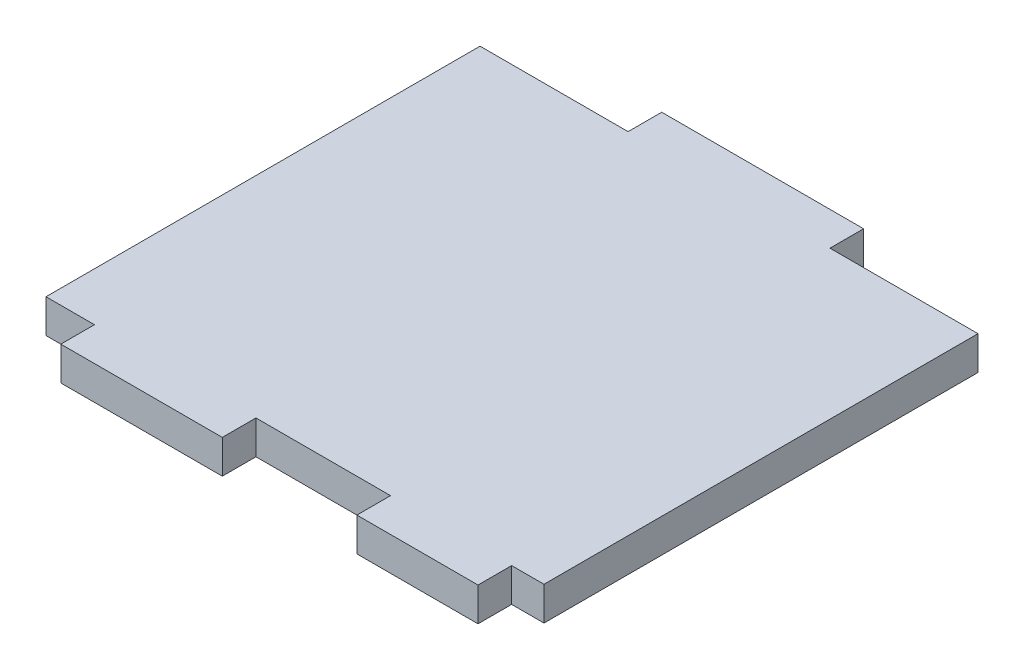
ISO-10303-21;
HEADER;
FILE_DESCRIPTION(('STEP AP214'),'2;1');
FILE_NAME('part.step','',(''),(''),'','','');
FILE_SCHEMA(('AUTOMOTIVE_DESIGN { 1 0 10303 214 1 1 1 1 }'));
ENDSEC;
DATA;
#1=APPLICATION_CONTEXT('core data for automotive mechanical design processes');
#2=APPLICATION_PROTOCOL_DEFINITION('international standard','automotive_design',2000,#1);
#3=PRODUCT_CONTEXT('',#1,'mechanical');
#4=PRODUCT('Part','Part','',(#3));
#5=PRODUCT_RELATED_PRODUCT_CATEGORY('part','',(#4));
#6=PRODUCT_DEFINITION_FORMATION('','',#4);
#7=PRODUCT_DEFINITION_CONTEXT('part definition',#1,'design');
#8=PRODUCT_DEFINITION('design','',#6,#7);
#9=PRODUCT_DEFINITION_SHAPE('','',#8);
#10=(LENGTH_UNIT() NAMED_UNIT(*) SI_UNIT(.MILLI.,.METRE.));
#11=(NAMED_UNIT(*) PLANE_ANGLE_UNIT() SI_UNIT($,.RADIAN.));
#12=(NAMED_UNIT(*) SI_UNIT($,.STERADIAN.) SOLID_ANGLE_UNIT());
#13=UNCERTAINTY_MEASURE_WITH_UNIT(LENGTH_MEASURE(1.E-05),#10,'distance_accuracy_value','');
#14=(GEOMETRIC_REPRESENTATION_CONTEXT(3) GLOBAL_UNCERTAINTY_ASSIGNED_CONTEXT((#13)) GLOBAL_UNIT_ASSIGNED_CONTEXT((#10,
#11,#12)) REPRESENTATION_CONTEXT('',''));
#15=CARTESIAN_POINT('',(0.,0.,0.));
#16=DIRECTION('',(0.,0.,1.));
#17=DIRECTION('',(1.,0.,0.));
#18=AXIS2_PLACEMENT_3D('',#15,#16,#17);
#19=CARTESIAN_POINT('',(0.,3.175,-40.9575));
#20=DIRECTION('',(1.,0.,0.));
#21=DIRECTION('',(0.,0.,-1.));
#22=AXIS2_PLACEMENT_3D('',#19,#20,#21);
#23=PLANE('',#22);
#24=DIRECTION('',(0.,0.,1.));
#25=VECTOR('',#24,1.);
#26=CARTESIAN_POINT('',(0.,0.,-40.9575));
#27=LINE('',#26,#25);
#28=CARTESIAN_POINT('',(0.,0.,-40.9575));
#29=VERTEX_POINT('',#28);
#30=CARTESIAN_POINT('',(0.,0.,0.));
#31=VERTEX_POINT('',#30);
#32=EDGE_CURVE('E177',#29,#31,#27,.T.);
#33=ORIENTED_EDGE('',*,*,#32,.T.);
#34=DIRECTION('',(0.,-1.,0.));
#35=VECTOR('',#34,1.);
#36=CARTESIAN_POINT('',(0.,3.175,0.));
#37=LINE('',#36,#35);
#38=CARTESIAN_POINT('',(0.,3.175,0.));
#39=VERTEX_POINT('',#38);
#40=EDGE_CURVE('E11',#39,#31,#37,.T.);
#41=ORIENTED_EDGE('',*,*,#40,.F.);
#42=DIRECTION('',(0.,0.,1.));
#43=VECTOR('',#42,1.);
#44=CARTESIAN_POINT('',(0.,3.175,-40.9575));
#45=LINE('',#44,#43);
#46=CARTESIAN_POINT('',(0.,3.175,-40.9575));
#47=VERTEX_POINT('',#46);
#48=EDGE_CURVE('E207',#47,#39,#45,.T.);
#49=ORIENTED_EDGE('',*,*,#48,.F.);
#50=DIRECTION('',(0.,-1.,0.));
#51=VECTOR('',#50,1.);
#52=CARTESIAN_POINT('',(0.,3.175,-40.9575));
#53=LINE('',#52,#51);
#54=EDGE_CURVE('E173',#47,#29,#53,.T.);
#55=ORIENTED_EDGE('',*,*,#54,.T.);
#56=EDGE_LOOP('',(#33,#41,#49,#55));
#57=FACE_BOUND('',#56,.T.);
#58=ADVANCED_FACE('F33',(#57),#23,.F.);
#59=CARTESIAN_POINT('',(0.,3.175,0.));
#60=DIRECTION('',(0.,0.,-1.));
#61=DIRECTION('',(-1.,0.,0.));
#62=AXIS2_PLACEMENT_3D('',#59,#60,#61);
#63=PLANE('',#62);
#64=DIRECTION('',(1.,0.,0.));
#65=VECTOR('',#64,1.);
#66=CARTESIAN_POINT('',(0.,0.,0.));
#67=LINE('',#66,#65);
#68=CARTESIAN_POINT('',(4.572,0.,0.));
#69=VERTEX_POINT('',#68);
#70=EDGE_CURVE('E180',#31,#69,#67,.T.);
#71=ORIENTED_EDGE('',*,*,#70,.T.);
#72=DIRECTION('',(0.,-1.,0.));
#73=VECTOR('',#72,1.);
#74=CARTESIAN_POINT('',(4.572,3.175,0.));
#75=LINE('',#74,#73);
#76=CARTESIAN_POINT('',(4.572,3.175,0.));
#77=VERTEX_POINT('',#76);
#78=EDGE_CURVE('E41',#77,#69,#75,.T.);
#79=ORIENTED_EDGE('',*,*,#78,.F.);
#80=DIRECTION('',(1.,0.,0.));
#81=VECTOR('',#80,1.);
#82=CARTESIAN_POINT('',(0.,3.175,0.));
#83=LINE('',#82,#81);
#84=EDGE_CURVE('E116',#39,#77,#83,.T.);
#85=ORIENTED_EDGE('',*,*,#84,.F.);
#86=ORIENTED_EDGE('',*,*,#40,.T.);
#87=EDGE_LOOP('',(#71,#79,#85,#86));
#88=FACE_BOUND('',#87,.T.);
#89=ADVANCED_FACE('F305',(#88),#63,.F.);
#90=CARTESIAN_POINT('',(4.572,3.175,0.));
#91=DIRECTION('',(1.,0.,0.));
#92=DIRECTION('',(0.,0.,-1.));
#93=AXIS2_PLACEMENT_3D('',#90,#91,#92);
#94=PLANE('',#93);
#95=DIRECTION('',(0.,0.,1.));
#96=VECTOR('',#95,1.);
#97=CARTESIAN_POINT('',(4.572,0.,0.));
#98=LINE('',#97,#96);
#99=CARTESIAN_POINT('',(4.572,0.,3.175));
#100=VERTEX_POINT('',#99);
#101=EDGE_CURVE('E182',#69,#100,#98,.T.);
#102=ORIENTED_EDGE('',*,*,#101,.T.);
#103=DIRECTION('',(0.,-1.,0.));
#104=VECTOR('',#103,1.);
#105=CARTESIAN_POINT('',(4.572,3.175,3.175));
#106=LINE('',#105,#104);
#107=CARTESIAN_POINT('',(4.572,3.175,3.175));
#108=VERTEX_POINT('',#107);
#109=EDGE_CURVE('E238',#108,#100,#106,.T.);
#110=ORIENTED_EDGE('',*,*,#109,.F.);
#111=DIRECTION('',(0.,0.,1.));
#112=VECTOR('',#111,1.);
#113=CARTESIAN_POINT('',(4.572,3.175,0.));
#114=LINE('',#113,#112);
#115=EDGE_CURVE('E246',#77,#108,#114,.T.);
#116=ORIENTED_EDGE('',*,*,#115,.F.);
#117=ORIENTED_EDGE('',*,*,#78,.T.);
#118=EDGE_LOOP('',(#102,#110,#116,#117));
#119=FACE_BOUND('',#118,.T.);
#120=ADVANCED_FACE('F244',(#119),#94,.F.);
#121=CARTESIAN_POINT('',(4.572,3.175,3.175));
#122=DIRECTION('',(0.,0.,-1.));
#123=DIRECTION('',(-1.,0.,0.));
#124=AXIS2_PLACEMENT_3D('',#121,#122,#123);
#125=PLANE('',#124);
#126=DIRECTION('',(1.,0.,0.));
#127=VECTOR('',#126,1.);
#128=CARTESIAN_POINT('',(4.572,0.,3.175));
#129=LINE('',#128,#127);
#130=CARTESIAN_POINT('',(19.812,0.,3.175));
#131=VERTEX_POINT('',#130);
#132=EDGE_CURVE('E184',#100,#131,#129,.T.);
#133=ORIENTED_EDGE('',*,*,#132,.T.);
#134=DIRECTION('',(0.,-1.,0.));
#135=VECTOR('',#134,1.);
#136=CARTESIAN_POINT('',(19.812,3.175,3.175));
#137=LINE('',#136,#135);
#138=CARTESIAN_POINT('',(19.812,3.175,3.175));
#139=VERTEX_POINT('',#138);
#140=EDGE_CURVE('E235',#139,#131,#137,.T.);
#141=ORIENTED_EDGE('',*,*,#140,.F.);
#142=DIRECTION('',(1.,0.,0.));
#143=VECTOR('',#142,1.);
#144=CARTESIAN_POINT('',(4.572,3.175,3.175));
#145=LINE('',#144,#143);
#146=EDGE_CURVE('E264',#108,#139,#145,.T.);
#147=ORIENTED_EDGE('',*,*,#146,.F.);
#148=ORIENTED_EDGE('',*,*,#109,.T.);
#149=EDGE_LOOP('',(#133,#141,#147,#148));
#150=FACE_BOUND('',#149,.T.);
#151=ADVANCED_FACE('F255',(#150),#125,.F.);
#152=CARTESIAN_POINT('',(19.812,3.175,3.175));
#153=DIRECTION('',(-1.,0.,0.));
#154=DIRECTION('',(0.,0.,1.));
#155=AXIS2_PLACEMENT_3D('',#152,#153,#154);
#156=PLANE('',#155);
#157=DIRECTION('',(0.,0.,-1.));
#158=VECTOR('',#157,1.);
#159=CARTESIAN_POINT('',(19.812,0.,3.175));
#160=LINE('',#159,#158);
#161=CARTESIAN_POINT('',(19.812,0.,0.));
#162=VERTEX_POINT('',#161);
#163=EDGE_CURVE('E186',#131,#162,#160,.T.);
#164=ORIENTED_EDGE('',*,*,#163,.T.);
#165=DIRECTION('',(0.,-1.,0.));
#166=VECTOR('',#165,1.);
#167=CARTESIAN_POINT('',(19.812,3.175,0.));
#168=LINE('',#167,#166);
#169=CARTESIAN_POINT('',(19.812,3.175,0.));
#170=VERTEX_POINT('',#169);
#171=EDGE_CURVE('E232',#170,#162,#168,.T.);
#172=ORIENTED_EDGE('',*,*,#171,.F.);
#173=DIRECTION('',(0.,0.,-1.));
#174=VECTOR('',#173,1.);
#175=CARTESIAN_POINT('',(19.812,3.175,3.175));
#176=LINE('',#175,#174);
#177=EDGE_CURVE('E261',#139,#170,#176,.T.);
#178=ORIENTED_EDGE('',*,*,#177,.F.);
#179=ORIENTED_EDGE('',*,*,#140,.T.);
#180=EDGE_LOOP('',(#164,#172,#178,#179));
#181=FACE_BOUND('',#180,.T.);
#182=ADVANCED_FACE('F259',(#181),#156,.F.);
#183=CARTESIAN_POINT('',(19.812,3.175,0.));
#184=DIRECTION('',(0.,0.,-1.));
#185=DIRECTION('',(-1.,0.,0.));
#186=AXIS2_PLACEMENT_3D('',#183,#184,#185);
#187=PLANE('',#186);
#188=DIRECTION('',(1.,0.,0.));
#189=VECTOR('',#188,1.);
#190=CARTESIAN_POINT('',(19.812,0.,0.));
#191=LINE('',#190,#189);
#192=CARTESIAN_POINT('',(32.512,0.,0.));
#193=VERTEX_POINT('',#192);
#194=EDGE_CURVE('E188',#162,#193,#191,.T.);
#195=ORIENTED_EDGE('',*,*,#194,.T.);
#196=DIRECTION('',(0.,-1.,0.));
#197=VECTOR('',#196,1.);
#198=CARTESIAN_POINT('',(32.512,3.175,0.));
#199=LINE('',#198,#197);
#200=CARTESIAN_POINT('',(32.512,3.175,0.));
#201=VERTEX_POINT('',#200);
#202=EDGE_CURVE('E229',#201,#193,#199,.T.);
#203=ORIENTED_EDGE('',*,*,#202,.F.);
#204=DIRECTION('',(1.,0.,0.));
#205=VECTOR('',#204,1.);
#206=CARTESIAN_POINT('',(19.812,3.175,0.));
#207=LINE('',#206,#205);
#208=EDGE_CURVE('E263',#170,#201,#207,.T.);
#209=ORIENTED_EDGE('',*,*,#208,.F.);
#210=ORIENTED_EDGE('',*,*,#171,.T.);
#211=EDGE_LOOP('',(#195,#203,#209,#210));
#212=FACE_BOUND('',#211,.T.);
#213=ADVANCED_FACE('F318',(#212),#187,.F.);
#214=CARTESIAN_POINT('',(32.512,3.175,0.));
#215=DIRECTION('',(1.,0.,0.));
#216=DIRECTION('',(0.,0.,-1.));
#217=AXIS2_PLACEMENT_3D('',#214,#215,#216);
#218=PLANE('',#217);
#219=DIRECTION('',(0.,0.,1.));
#220=VECTOR('',#219,1.);
#221=CARTESIAN_POINT('',(32.512,0.,0.));
#222=LINE('',#221,#220);
#223=CARTESIAN_POINT('',(32.512,0.,3.175));
#224=VERTEX_POINT('',#223);
#225=EDGE_CURVE('E190',#193,#224,#222,.T.);
#226=ORIENTED_EDGE('',*,*,#225,.T.);
#227=DIRECTION('',(0.,-1.,0.));
#228=VECTOR('',#227,1.);
#229=CARTESIAN_POINT('',(32.512,3.175,3.175));
#230=LINE('',#229,#228);
#231=CARTESIAN_POINT('',(32.512,3.175,3.175));
#232=VERTEX_POINT('',#231);
#233=EDGE_CURVE('E226',#232,#224,#230,.T.);
#234=ORIENTED_EDGE('',*,*,#233,.F.);
#235=DIRECTION('',(0.,0.,1.));
#236=VECTOR('',#235,1.);
#237=CARTESIAN_POINT('',(32.512,3.175,0.));
#238=LINE('',#237,#236);
#239=EDGE_CURVE('E266',#201,#232,#238,.T.);
#240=ORIENTED_EDGE('',*,*,#239,.F.);
#241=ORIENTED_EDGE('',*,*,#202,.T.);
#242=EDGE_LOOP('',(#226,#234,#240,#241));
#243=FACE_BOUND('',#242,.T.);
#244=ADVANCED_FACE('F321',(#243),#218,.F.);
#245=CARTESIAN_POINT('',(32.512,3.175,3.175));
#246=DIRECTION('',(0.,0.,-1.));
#247=DIRECTION('',(-1.,0.,0.));
#248=AXIS2_PLACEMENT_3D('',#245,#246,#247);
#249=PLANE('',#248);
#250=DIRECTION('',(1.,0.,0.));
#251=VECTOR('',#250,1.);
#252=CARTESIAN_POINT('',(32.512,0.,3.175));
#253=LINE('',#252,#251);
#254=CARTESIAN_POINT('',(43.942,0.,3.175));
#255=VERTEX_POINT('',#254);
#256=EDGE_CURVE('E192',#224,#255,#253,.T.);
#257=ORIENTED_EDGE('',*,*,#256,.T.);
#258=DIRECTION('',(0.,-1.,0.));
#259=VECTOR('',#258,1.);
#260=CARTESIAN_POINT('',(43.942,3.175,3.175));
#261=LINE('',#260,#259);
#262=CARTESIAN_POINT('',(43.942,3.175,3.175));
#263=VERTEX_POINT('',#262);
#264=EDGE_CURVE('E223',#263,#255,#261,.T.);
#265=ORIENTED_EDGE('',*,*,#264,.F.);
#266=DIRECTION('',(1.,0.,0.));
#267=VECTOR('',#266,1.);
#268=CARTESIAN_POINT('',(32.512,3.175,3.175));
#269=LINE('',#268,#267);
#270=EDGE_CURVE('E272',#232,#263,#269,.T.);
#271=ORIENTED_EDGE('',*,*,#270,.F.);
#272=ORIENTED_EDGE('',*,*,#233,.T.);
#273=EDGE_LOOP('',(#257,#265,#271,#272));
#274=FACE_BOUND('',#273,.T.);
#275=ADVANCED_FACE('F325',(#274),#249,.F.);
#276=CARTESIAN_POINT('',(43.942,3.175,3.175));
#277=DIRECTION('',(-1.,0.,0.));
#278=DIRECTION('',(0.,0.,1.));
#279=AXIS2_PLACEMENT_3D('',#276,#277,#278);
#280=PLANE('',#279);
#281=DIRECTION('',(0.,0.,-1.));
#282=VECTOR('',#281,1.);
#283=CARTESIAN_POINT('',(43.942,0.,3.175));
#284=LINE('',#283,#282);
#285=CARTESIAN_POINT('',(43.942,0.,0.));
#286=VERTEX_POINT('',#285);
#287=EDGE_CURVE('E194',#255,#286,#284,.T.);
#288=ORIENTED_EDGE('',*,*,#287,.T.);
#289=DIRECTION('',(0.,-1.,0.));
#290=VECTOR('',#289,1.);
#291=CARTESIAN_POINT('',(43.942,3.175,0.));
#292=LINE('',#291,#290);
#293=CARTESIAN_POINT('',(43.942,3.175,0.));
#294=VERTEX_POINT('',#293);
#295=EDGE_CURVE('E220',#294,#286,#292,.T.);
#296=ORIENTED_EDGE('',*,*,#295,.F.);
#297=DIRECTION('',(0.,0.,-1.));
#298=VECTOR('',#297,1.);
#299=CARTESIAN_POINT('',(43.942,3.175,3.175));
#300=LINE('',#299,#298);
#301=EDGE_CURVE('E274',#263,#294,#300,.T.);
#302=ORIENTED_EDGE('',*,*,#301,.F.);
#303=ORIENTED_EDGE('',*,*,#264,.T.);
#304=EDGE_LOOP('',(#288,#296,#302,#303));
#305=FACE_BOUND('',#304,.T.);
#306=ADVANCED_FACE('F329',(#305),#280,.F.);
#307=CARTESIAN_POINT('',(43.942,3.175,0.));
#308=DIRECTION('',(0.,0.,-1.));
#309=DIRECTION('',(-1.,0.,0.));
#310=AXIS2_PLACEMENT_3D('',#307,#308,#309);
#311=PLANE('',#310);
#312=DIRECTION('',(1.,0.,0.));
#313=VECTOR('',#312,1.);
#314=CARTESIAN_POINT('',(43.942,0.,0.));
#315=LINE('',#314,#313);
#316=CARTESIAN_POINT('',(46.993048,0.,0.));
#317=VERTEX_POINT('',#316);
#318=EDGE_CURVE('E196',#286,#317,#315,.T.);
#319=ORIENTED_EDGE('',*,*,#318,.T.);
#320=DIRECTION('',(0.,-1.,0.));
#321=VECTOR('',#320,1.);
#322=CARTESIAN_POINT('',(46.993048,3.175,0.));
#323=LINE('',#322,#321);
#324=CARTESIAN_POINT('',(46.993048,3.175,0.));
#325=VERTEX_POINT('',#324);
#326=EDGE_CURVE('E217',#325,#317,#323,.T.);
#327=ORIENTED_EDGE('',*,*,#326,.F.);
#328=DIRECTION('',(1.,0.,0.));
#329=VECTOR('',#328,1.);
#330=CARTESIAN_POINT('',(43.942,3.175,0.));
#331=LINE('',#330,#329);
#332=EDGE_CURVE('E276',#294,#325,#331,.T.);
#333=ORIENTED_EDGE('',*,*,#332,.F.);
#334=ORIENTED_EDGE('',*,*,#295,.T.);
#335=EDGE_LOOP('',(#319,#327,#333,#334));
#336=FACE_BOUND('',#335,.T.);
#337=ADVANCED_FACE('F333',(#336),#311,.F.);
#338=CARTESIAN_POINT('',(46.993048,3.175,0.));
#339=DIRECTION('',(-1.,0.,0.));
#340=DIRECTION('',(0.,0.,1.));
#341=AXIS2_PLACEMENT_3D('',#338,#339,#340);
#342=PLANE('',#341);
#343=DIRECTION('',(0.,0.,-1.));
#344=VECTOR('',#343,1.);
#345=CARTESIAN_POINT('',(46.993048,0.,0.));
#346=LINE('',#345,#344);
#347=CARTESIAN_POINT('',(46.993048,0.,-40.9575));
#348=VERTEX_POINT('',#347);
#349=EDGE_CURVE('E198',#317,#348,#346,.T.);
#350=ORIENTED_EDGE('',*,*,#349,.T.);
#351=DIRECTION('',(0.,-1.,0.));
#352=VECTOR('',#351,1.);
#353=CARTESIAN_POINT('',(46.993048,3.175,-40.9575));
#354=LINE('',#353,#352);
#355=CARTESIAN_POINT('',(46.993048,3.175,-40.9575));
#356=VERTEX_POINT('',#355);
#357=EDGE_CURVE('E214',#356,#348,#354,.T.);
#358=ORIENTED_EDGE('',*,*,#357,.F.);
#359=DIRECTION('',(0.,0.,-1.));
#360=VECTOR('',#359,1.);
#361=CARTESIAN_POINT('',(46.993048,3.175,0.));
#362=LINE('',#361,#360);
#363=EDGE_CURVE('E278',#325,#356,#362,.T.);
#364=ORIENTED_EDGE('',*,*,#363,.F.);
#365=ORIENTED_EDGE('',*,*,#326,.T.);
#366=EDGE_LOOP('',(#350,#358,#364,#365));
#367=FACE_BOUND('',#366,.T.);
#368=ADVANCED_FACE('F337',(#367),#342,.F.);
#369=CARTESIAN_POINT('',(46.993048,3.175,-40.9575));
#370=DIRECTION('',(0.,0.,1.));
#371=DIRECTION('',(1.,0.,0.));
#372=AXIS2_PLACEMENT_3D('',#369,#370,#371);
#373=PLANE('',#372);
#374=DIRECTION('',(-1.,0.,0.));
#375=VECTOR('',#374,1.);
#376=CARTESIAN_POINT('',(46.993048,0.,-40.9575));
#377=LINE('',#376,#375);
#378=CARTESIAN_POINT('',(33.021524,0.,-40.9575));
#379=VERTEX_POINT('',#378);
#380=EDGE_CURVE('E200',#348,#379,#377,.T.);
#381=ORIENTED_EDGE('',*,*,#380,.T.);
#382=DIRECTION('',(0.,-1.,0.));
#383=VECTOR('',#382,1.);
#384=CARTESIAN_POINT('',(33.021524,3.175,-40.9575));
#385=LINE('',#384,#383);
#386=CARTESIAN_POINT('',(33.021524,3.175,-40.9575));
#387=VERTEX_POINT('',#386);
#388=EDGE_CURVE('E211',#387,#379,#385,.T.);
#389=ORIENTED_EDGE('',*,*,#388,.F.);
#390=DIRECTION('',(-1.,0.,0.));
#391=VECTOR('',#390,1.);
#392=CARTESIAN_POINT('',(46.993048,3.175,-40.9575));
#393=LINE('',#392,#391);
#394=EDGE_CURVE('E280',#356,#387,#393,.T.);
#395=ORIENTED_EDGE('',*,*,#394,.F.);
#396=ORIENTED_EDGE('',*,*,#357,.T.);
#397=EDGE_LOOP('',(#381,#389,#395,#396));
#398=FACE_BOUND('',#397,.T.);
#399=ADVANCED_FACE('F286',(#398),#373,.F.);
#400=CARTESIAN_POINT('',(33.021524,3.175,-40.9575));
#401=DIRECTION('',(-1.,0.,0.));
#402=DIRECTION('',(0.,0.,1.));
#403=AXIS2_PLACEMENT_3D('',#400,#401,#402);
#404=PLANE('',#403);
#405=DIRECTION('',(0.,0.,-1.));
#406=VECTOR('',#405,1.);
#407=CARTESIAN_POINT('',(33.021524,0.,-40.9575));
#408=LINE('',#407,#406);
#409=CARTESIAN_POINT('',(33.021524,0.,-44.1325));
#410=VERTEX_POINT('',#409);
#411=EDGE_CURVE('E202',#379,#410,#408,.T.);
#412=ORIENTED_EDGE('',*,*,#411,.T.);
#413=DIRECTION('',(0.,-1.,0.));
#414=VECTOR('',#413,1.);
#415=CARTESIAN_POINT('',(33.021524,3.175,-44.1325));
#416=LINE('',#415,#414);
#417=CARTESIAN_POINT('',(33.021524,3.175,-44.1325));
#418=VERTEX_POINT('',#417);
#419=EDGE_CURVE('E168',#418,#410,#416,.T.);
#420=ORIENTED_EDGE('',*,*,#419,.F.);
#421=DIRECTION('',(0.,0.,-1.));
#422=VECTOR('',#421,1.);
#423=CARTESIAN_POINT('',(33.021524,3.175,-40.9575));
#424=LINE('',#423,#422);
#425=EDGE_CURVE('E159',#387,#418,#424,.T.);
#426=ORIENTED_EDGE('',*,*,#425,.F.);
#427=ORIENTED_EDGE('',*,*,#388,.T.);
#428=EDGE_LOOP('',(#412,#420,#426,#427));
#429=FACE_BOUND('',#428,.T.);
#430=ADVANCED_FACE('F290',(#429),#404,.F.);
#431=CARTESIAN_POINT('',(33.021524,3.175,-44.1325));
#432=DIRECTION('',(0.,0.,1.));
#433=DIRECTION('',(1.,0.,0.));
#434=AXIS2_PLACEMENT_3D('',#431,#432,#433);
#435=PLANE('',#434);
#436=DIRECTION('',(-1.,0.,0.));
#437=VECTOR('',#436,1.);
#438=CARTESIAN_POINT('',(33.021524,0.,-44.1325));
#439=LINE('',#438,#437);
#440=CARTESIAN_POINT('',(13.971524,0.,-44.1325));
#441=VERTEX_POINT('',#440);
#442=EDGE_CURVE('E167',#410,#441,#439,.T.);
#443=ORIENTED_EDGE('',*,*,#442,.T.);
#444=DIRECTION('',(0.,-1.,0.));
#445=VECTOR('',#444,1.);
#446=CARTESIAN_POINT('',(13.971524,3.175,-44.1325));
#447=LINE('',#446,#445);
#448=CARTESIAN_POINT('',(13.971524,3.175,-44.1325));
#449=VERTEX_POINT('',#448);
#450=EDGE_CURVE('E164',#449,#441,#447,.T.);
#451=ORIENTED_EDGE('',*,*,#450,.F.);
#452=DIRECTION('',(-1.,0.,0.));
#453=VECTOR('',#452,1.);
#454=CARTESIAN_POINT('',(33.021524,3.175,-44.1325));
#455=LINE('',#454,#453);
#456=EDGE_CURVE('E153',#418,#449,#455,.T.);
#457=ORIENTED_EDGE('',*,*,#456,.F.);
#458=ORIENTED_EDGE('',*,*,#419,.T.);
#459=EDGE_LOOP('',(#443,#451,#457,#458));
#460=FACE_BOUND('',#459,.T.);
#461=ADVANCED_FACE('F165',(#460),#435,.F.);
#462=CARTESIAN_POINT('',(13.971524,3.175,-44.1325));
#463=DIRECTION('',(1.,0.,0.));
#464=DIRECTION('',(0.,0.,-1.));
#465=AXIS2_PLACEMENT_3D('',#462,#463,#464);
#466=PLANE('',#465);
#467=DIRECTION('',(0.,0.,1.));
#468=VECTOR('',#467,1.);
#469=CARTESIAN_POINT('',(13.971524,0.,-44.1325));
#470=LINE('',#469,#468);
#471=CARTESIAN_POINT('',(13.971524,0.,-40.9575));
#472=VERTEX_POINT('',#471);
#473=EDGE_CURVE('E102',#441,#472,#470,.T.);
#474=ORIENTED_EDGE('',*,*,#473,.T.);
#475=DIRECTION('',(0.,-1.,0.));
#476=VECTOR('',#475,1.);
#477=CARTESIAN_POINT('',(13.971524,3.175,-40.9575));
#478=LINE('',#477,#476);
#479=CARTESIAN_POINT('',(13.971524,3.175,-40.9575));
#480=VERTEX_POINT('',#479);
#481=EDGE_CURVE('E169',#480,#472,#478,.T.);
#482=ORIENTED_EDGE('',*,*,#481,.F.);
#483=DIRECTION('',(0.,0.,1.));
#484=VECTOR('',#483,1.);
#485=CARTESIAN_POINT('',(13.971524,3.175,-44.1325));
#486=LINE('',#485,#484);
#487=EDGE_CURVE('E157',#449,#480,#486,.T.);
#488=ORIENTED_EDGE('',*,*,#487,.F.);
#489=ORIENTED_EDGE('',*,*,#450,.T.);
#490=EDGE_LOOP('',(#474,#482,#488,#489));
#491=FACE_BOUND('',#490,.T.);
#492=ADVANCED_FACE('F171',(#491),#466,.F.);
#493=CARTESIAN_POINT('',(13.971524,3.175,-40.9575));
#494=DIRECTION('',(0.,0.,1.));
#495=DIRECTION('',(1.,0.,0.));
#496=AXIS2_PLACEMENT_3D('',#493,#494,#495);
#497=PLANE('',#496);
#498=DIRECTION('',(-1.,0.,0.));
#499=VECTOR('',#498,1.);
#500=CARTESIAN_POINT('',(13.971524,0.,-40.9575));
#501=LINE('',#500,#499);
#502=EDGE_CURVE('E108',#472,#29,#501,.T.);
#503=ORIENTED_EDGE('',*,*,#502,.T.);
#504=ORIENTED_EDGE('',*,*,#54,.F.);
#505=DIRECTION('',(-1.,0.,0.));
#506=VECTOR('',#505,1.);
#507=CARTESIAN_POINT('',(13.971524,3.175,-40.9575));
#508=LINE('',#507,#506);
#509=EDGE_CURVE('E49',#480,#47,#508,.T.);
#510=ORIENTED_EDGE('',*,*,#509,.F.);
#511=ORIENTED_EDGE('',*,*,#481,.T.);
#512=EDGE_LOOP('',(#503,#504,#510,#511));
#513=FACE_BOUND('',#512,.T.);
#514=ADVANCED_FACE('F294',(#513),#497,.F.);
#515=CARTESIAN_POINT('',(0.,3.175,0.));
#516=DIRECTION('',(0.,1.,0.));
#517=DIRECTION('',(0.,0.,1.));
#518=AXIS2_PLACEMENT_3D('',#515,#516,#517);
#519=PLANE('',#518);
#520=ORIENTED_EDGE('',*,*,#48,.T.);
#521=ORIENTED_EDGE('',*,*,#84,.T.);
#522=ORIENTED_EDGE('',*,*,#115,.T.);
#523=ORIENTED_EDGE('',*,*,#146,.T.);
#524=ORIENTED_EDGE('',*,*,#177,.T.);
#525=ORIENTED_EDGE('',*,*,#208,.T.);
#526=ORIENTED_EDGE('',*,*,#239,.T.);
#527=ORIENTED_EDGE('',*,*,#270,.T.);
#528=ORIENTED_EDGE('',*,*,#301,.T.);
#529=ORIENTED_EDGE('',*,*,#332,.T.);
#530=ORIENTED_EDGE('',*,*,#363,.T.);
#531=ORIENTED_EDGE('',*,*,#394,.T.);
#532=ORIENTED_EDGE('',*,*,#425,.T.);
#533=ORIENTED_EDGE('',*,*,#456,.T.);
#534=ORIENTED_EDGE('',*,*,#487,.T.);
#535=ORIENTED_EDGE('',*,*,#509,.T.);
#536=EDGE_LOOP('',(#520,#521,#522,#523,#524,#525,#526,#527,#528,#529,#530,#531,#532,#533,#534,#535));
#537=FACE_BOUND('',#536,.T.);
#538=ADVANCED_FACE('F155',(#537),#519,.T.);
#539=CARTESIAN_POINT('',(0.,0.,0.));
#540=DIRECTION('',(0.,1.,0.));
#541=DIRECTION('',(0.,0.,1.));
#542=AXIS2_PLACEMENT_3D('',#539,#540,#541);
#543=PLANE('',#542);
#544=ORIENTED_EDGE('',*,*,#32,.F.);
#545=ORIENTED_EDGE('',*,*,#502,.F.);
#546=ORIENTED_EDGE('',*,*,#473,.F.);
#547=ORIENTED_EDGE('',*,*,#442,.F.);
#548=ORIENTED_EDGE('',*,*,#411,.F.);
#549=ORIENTED_EDGE('',*,*,#380,.F.);
#550=ORIENTED_EDGE('',*,*,#349,.F.);
#551=ORIENTED_EDGE('',*,*,#318,.F.);
#552=ORIENTED_EDGE('',*,*,#287,.F.);
#553=ORIENTED_EDGE('',*,*,#256,.F.);
#554=ORIENTED_EDGE('',*,*,#225,.F.);
#555=ORIENTED_EDGE('',*,*,#194,.F.);
#556=ORIENTED_EDGE('',*,*,#163,.F.);
#557=ORIENTED_EDGE('',*,*,#132,.F.);
#558=ORIENTED_EDGE('',*,*,#101,.F.);
#559=ORIENTED_EDGE('',*,*,#70,.F.);
#560=EDGE_LOOP('',(#544,#545,#546,#547,#548,#549,#550,#551,#552,#553,#554,#555,#556,#557,#558,#559));
#561=FACE_BOUND('',#560,.T.);
#562=ADVANCED_FACE('F250',(#561),#543,.F.);
#563=CLOSED_SHELL('',(#58,#89,#120,#151,#182,#213,#244,#275,#306,#337,#368,#399,#430,#461,#492,
#514,#538,#562));
#564=MANIFOLD_SOLID_BREP('B2',#563);
#565=ADVANCED_BREP_SHAPE_REPRESENTATION('',(#18,#564),#14);
#566=SHAPE_DEFINITION_REPRESENTATION(#9,#565);
ENDSEC;
END-ISO-10303-21;
